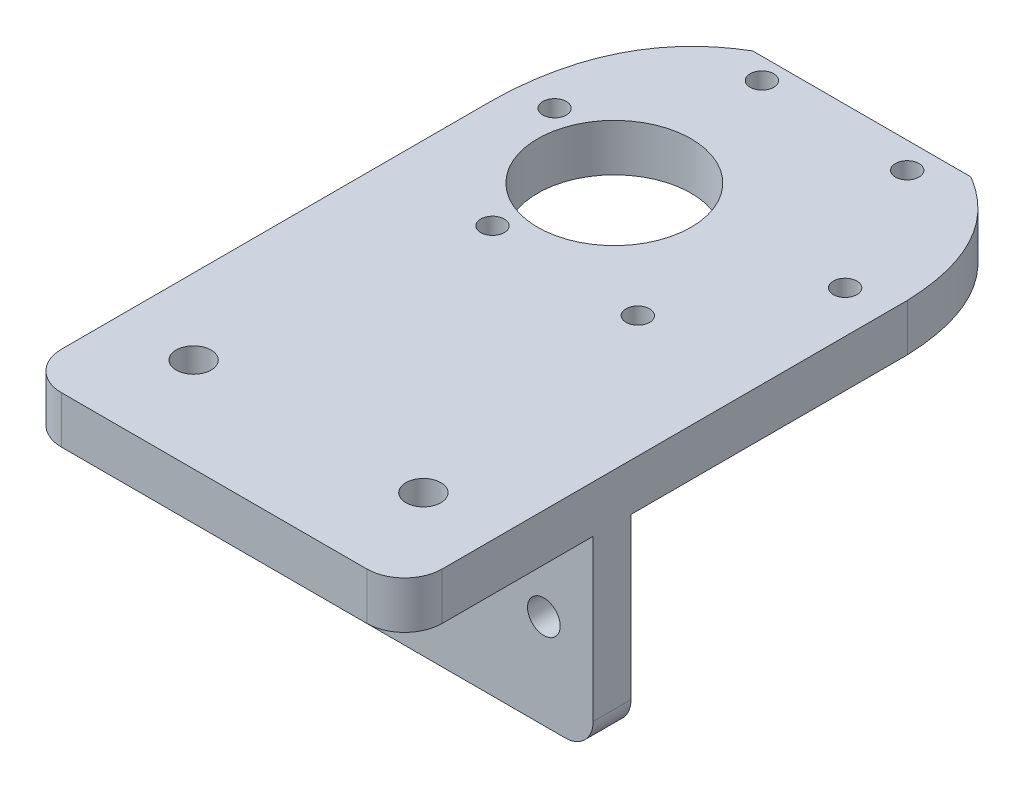
ISO-10303-21;
HEADER;
FILE_DESCRIPTION(('STEP AP214'),'2;1');
FILE_NAME('part.step','',(''),(''),'','','');
FILE_SCHEMA(('AUTOMOTIVE_DESIGN { 1 0 10303 214 1 1 1 1 }'));
ENDSEC;
DATA;
#1=APPLICATION_CONTEXT('core data for automotive mechanical design processes');
#2=APPLICATION_PROTOCOL_DEFINITION('international standard','automotive_design',2000,#1);
#3=PRODUCT_CONTEXT('',#1,'mechanical');
#4=PRODUCT('Part','Part','',(#3));
#5=PRODUCT_RELATED_PRODUCT_CATEGORY('part','',(#4));
#6=PRODUCT_DEFINITION_FORMATION('','',#4);
#7=PRODUCT_DEFINITION_CONTEXT('part definition',#1,'design');
#8=PRODUCT_DEFINITION('design','',#6,#7);
#9=PRODUCT_DEFINITION_SHAPE('','',#8);
#10=(LENGTH_UNIT() NAMED_UNIT(*) SI_UNIT(.MILLI.,.METRE.));
#11=(NAMED_UNIT(*) PLANE_ANGLE_UNIT() SI_UNIT($,.RADIAN.));
#12=(NAMED_UNIT(*) SI_UNIT($,.STERADIAN.) SOLID_ANGLE_UNIT());
#13=UNCERTAINTY_MEASURE_WITH_UNIT(LENGTH_MEASURE(1.E-05),#10,'distance_accuracy_value','');
#14=(GEOMETRIC_REPRESENTATION_CONTEXT(3) GLOBAL_UNCERTAINTY_ASSIGNED_CONTEXT((#13)) GLOBAL_UNIT_ASSIGNED_CONTEXT((#10,
#11,#12)) REPRESENTATION_CONTEXT('',''));
#15=CARTESIAN_POINT('',(0.,0.,0.));
#16=DIRECTION('',(0.,0.,1.));
#17=DIRECTION('',(1.,0.,0.));
#18=AXIS2_PLACEMENT_3D('',#15,#16,#17);
#19=CARTESIAN_POINT('',(42.1412127925836,-12.433023222912,0.));
#20=DIRECTION('',(0.,0.,1.));
#21=DIRECTION('',(1.,0.,0.));
#22=AXIS2_PLACEMENT_3D('',#19,#20,#21);
#23=PLANE('',#22);
#24=CARTESIAN_POINT('',(41.9112127925836,-59.4330232229214,0.));
#25=DIRECTION('',(0.,0.,1.));
#26=DIRECTION('',(1.,0.,0.));
#27=AXIS2_PLACEMENT_3D('',#24,#25,#26);
#28=CIRCLE('',#27,1.73);
#29=CARTESIAN_POINT('',(43.6412127925836,-59.4330232229214,0.));
#30=VERTEX_POINT('',#29);
#31=EDGE_CURVE('E195',#30,#30,#28,.T.);
#32=ORIENTED_EDGE('',*,*,#31,.T.);
#33=EDGE_LOOP('',(#32));
#34=FACE_BOUND('',#33,.T.);
#35=CARTESIAN_POINT('',(12.0212127925836,-59.4330232229214,0.));
#36=DIRECTION('',(0.,0.,1.));
#37=DIRECTION('',(1.,0.,0.));
#38=AXIS2_PLACEMENT_3D('',#35,#36,#37);
#39=CIRCLE('',#38,1.73);
#40=CARTESIAN_POINT('',(13.7512127925836,-59.4330232229214,0.));
#41=VERTEX_POINT('',#40);
#42=EDGE_CURVE('E199',#41,#41,#39,.T.);
#43=ORIENTED_EDGE('',*,*,#42,.T.);
#44=EDGE_LOOP('',(#43));
#45=FACE_BOUND('',#44,.T.);
#46=DIRECTION('',(-1.,0.,0.));
#47=VECTOR('',#46,1.);
#48=CARTESIAN_POINT('',(6.79121279258359,-49.4330232229125,0.));
#49=LINE('',#48,#47);
#50=CARTESIAN_POINT('',(47.1412127925836,-49.4330232229125,0.));
#51=VERTEX_POINT('',#50);
#52=CARTESIAN_POINT('',(6.79121279258359,-49.4330232229125,0.));
#53=VERTEX_POINT('',#52);
#54=EDGE_CURVE('E163',#51,#53,#49,.T.);
#55=ORIENTED_EDGE('',*,*,#54,.F.);
#56=DIRECTION('',(0.,1.,0.));
#57=VECTOR('',#56,1.);
#58=CARTESIAN_POINT('',(47.1412127925836,-66.4330232229125,0.));
#59=LINE('',#58,#57);
#60=CARTESIAN_POINT('',(47.1412127925836,-66.4330232229125,0.));
#61=VERTEX_POINT('',#60);
#62=EDGE_CURVE('E211',#61,#51,#59,.T.);
#63=ORIENTED_EDGE('',*,*,#62,.F.);
#64=CARTESIAN_POINT('',(44.1412127925836,-66.4330232229125,0.));
#65=DIRECTION('',(0.,0.,1.));
#66=DIRECTION('',(-1.,0.,0.));
#67=AXIS2_PLACEMENT_3D('',#64,#65,#66);
#68=CIRCLE('',#67,3.);
#69=CARTESIAN_POINT('',(44.1412127925836,-69.4330232229125,0.));
#70=VERTEX_POINT('',#69);
#71=EDGE_CURVE('E226',#70,#61,#68,.T.);
#72=ORIENTED_EDGE('',*,*,#71,.F.);
#73=DIRECTION('',(1.,0.,0.));
#74=VECTOR('',#73,1.);
#75=CARTESIAN_POINT('',(44.1412127925836,-69.4330232229125,0.));
#76=LINE('',#75,#74);
#77=CARTESIAN_POINT('',(9.79121279258358,-69.4330232229125,0.));
#78=VERTEX_POINT('',#77);
#79=EDGE_CURVE('E224',#78,#70,#76,.T.);
#80=ORIENTED_EDGE('',*,*,#79,.F.);
#81=CARTESIAN_POINT('',(9.79121279258358,-66.4330232229125,0.));
#82=DIRECTION('',(0.,0.,1.));
#83=DIRECTION('',(1.,0.,0.));
#84=AXIS2_PLACEMENT_3D('',#81,#82,#83);
#85=CIRCLE('',#84,3.);
#86=CARTESIAN_POINT('',(6.79121279258358,-66.4330232229125,0.));
#87=VERTEX_POINT('',#86);
#88=EDGE_CURVE('E222',#87,#78,#85,.T.);
#89=ORIENTED_EDGE('',*,*,#88,.F.);
#90=DIRECTION('',(0.,-1.,0.));
#91=VECTOR('',#90,1.);
#92=CARTESIAN_POINT('',(6.7912127925836,-12.433023222912,0.));
#93=LINE('',#92,#91);
#94=EDGE_CURVE('E205',#53,#87,#93,.T.);
#95=ORIENTED_EDGE('',*,*,#94,.F.);
#96=EDGE_LOOP('',(#55,#63,#72,#80,#89,#95));
#97=FACE_BOUND('',#96,.T.);
#98=ADVANCED_FACE('F43',(#34,#45,#97),#23,.F.);
#99=CARTESIAN_POINT('',(42.1412127925836,-12.433023222912,4.));
#100=DIRECTION('',(0.,0.,1.));
#101=DIRECTION('',(1.,0.,0.));
#102=AXIS2_PLACEMENT_3D('',#99,#100,#101);
#103=PLANE('',#102);
#104=DIRECTION('',(1.,0.,0.));
#105=VECTOR('',#104,1.);
#106=CARTESIAN_POINT('',(47.1412127925836,-49.4330232229125,4.));
#107=LINE('',#106,#105);
#108=CARTESIAN_POINT('',(6.79121279258359,-49.4330232229125,4.));
#109=VERTEX_POINT('',#108);
#110=CARTESIAN_POINT('',(47.1412127925836,-49.4330232229125,4.));
#111=VERTEX_POINT('',#110);
#112=EDGE_CURVE('E181',#109,#111,#107,.T.);
#113=ORIENTED_EDGE('',*,*,#112,.F.);
#114=DIRECTION('',(0.,-1.,0.));
#115=VECTOR('',#114,1.);
#116=CARTESIAN_POINT('',(6.7912127925836,-12.433023222912,4.));
#117=LINE('',#116,#115);
#118=CARTESIAN_POINT('',(6.79121279258358,-66.4330232229125,4.));
#119=VERTEX_POINT('',#118);
#120=EDGE_CURVE('E208',#109,#119,#117,.T.);
#121=ORIENTED_EDGE('',*,*,#120,.T.);
#122=CARTESIAN_POINT('',(9.79121279258358,-66.4330232229125,4.));
#123=DIRECTION('',(0.,0.,1.));
#124=DIRECTION('',(1.,0.,0.));
#125=AXIS2_PLACEMENT_3D('',#122,#123,#124);
#126=CIRCLE('',#125,3.);
#127=CARTESIAN_POINT('',(9.79121279258358,-69.4330232229125,4.));
#128=VERTEX_POINT('',#127);
#129=EDGE_CURVE('E210',#119,#128,#126,.T.);
#130=ORIENTED_EDGE('',*,*,#129,.T.);
#131=DIRECTION('',(1.,0.,0.));
#132=VECTOR('',#131,1.);
#133=CARTESIAN_POINT('',(44.1412127925836,-69.4330232229125,4.));
#134=LINE('',#133,#132);
#135=CARTESIAN_POINT('',(44.1412127925836,-69.4330232229125,4.));
#136=VERTEX_POINT('',#135);
#137=EDGE_CURVE('E213',#128,#136,#134,.T.);
#138=ORIENTED_EDGE('',*,*,#137,.T.);
#139=CARTESIAN_POINT('',(44.1412127925836,-66.4330232229125,4.));
#140=DIRECTION('',(0.,0.,1.));
#141=DIRECTION('',(-1.,0.,0.));
#142=AXIS2_PLACEMENT_3D('',#139,#140,#141);
#143=CIRCLE('',#142,3.);
#144=CARTESIAN_POINT('',(47.1412127925836,-66.4330232229125,4.));
#145=VERTEX_POINT('',#144);
#146=EDGE_CURVE('E215',#136,#145,#143,.T.);
#147=ORIENTED_EDGE('',*,*,#146,.T.);
#148=DIRECTION('',(0.,1.,0.));
#149=VECTOR('',#148,1.);
#150=CARTESIAN_POINT('',(47.1412127925836,-66.4330232229125,4.));
#151=LINE('',#150,#149);
#152=EDGE_CURVE('E217',#145,#111,#151,.T.);
#153=ORIENTED_EDGE('',*,*,#152,.T.);
#154=EDGE_LOOP('',(#113,#121,#130,#138,#147,#153));
#155=FACE_BOUND('',#154,.T.);
#156=CARTESIAN_POINT('',(12.0212127925836,-59.4330232229214,4.));
#157=DIRECTION('',(0.,0.,1.));
#158=DIRECTION('',(1.,0.,0.));
#159=AXIS2_PLACEMENT_3D('',#156,#157,#158);
#160=CIRCLE('',#159,1.73);
#161=CARTESIAN_POINT('',(13.7512127925836,-59.4330232229214,4.));
#162=VERTEX_POINT('',#161);
#163=EDGE_CURVE('E202',#162,#162,#160,.T.);
#164=ORIENTED_EDGE('',*,*,#163,.F.);
#165=EDGE_LOOP('',(#164));
#166=FACE_BOUND('',#165,.T.);
#167=CARTESIAN_POINT('',(41.9112127925836,-59.4330232229214,4.));
#168=DIRECTION('',(0.,0.,1.));
#169=DIRECTION('',(1.,0.,0.));
#170=AXIS2_PLACEMENT_3D('',#167,#168,#169);
#171=CIRCLE('',#170,1.73);
#172=CARTESIAN_POINT('',(43.6412127925836,-59.4330232229214,4.));
#173=VERTEX_POINT('',#172);
#174=EDGE_CURVE('E196',#173,#173,#171,.T.);
#175=ORIENTED_EDGE('',*,*,#174,.F.);
#176=EDGE_LOOP('',(#175));
#177=FACE_BOUND('',#176,.T.);
#178=ADVANCED_FACE('F282',(#155,#166,#177),#103,.T.);
#179=CARTESIAN_POINT('',(6.7912127925836,-12.433023222912,4.));
#180=DIRECTION('',(1.,0.,0.));
#181=DIRECTION('',(0.,1.,0.));
#182=AXIS2_PLACEMENT_3D('',#179,#180,#181);
#183=PLANE('',#182);
#184=DIRECTION('',(0.,0.,-1.));
#185=VECTOR('',#184,1.);
#186=CARTESIAN_POINT('',(6.79121279258359,-44.4330232229125,24.));
#187=LINE('',#186,#185);
#188=CARTESIAN_POINT('',(6.79121279258359,-44.4330232229125,20.));
#189=VERTEX_POINT('',#188);
#190=CARTESIAN_POINT('',(6.79121279248702,-44.4330232229125,-25.4525738160012));
#191=VERTEX_POINT('',#190);
#192=EDGE_CURVE('E193',#189,#191,#187,.T.);
#193=ORIENTED_EDGE('',*,*,#192,.T.);
#194=DIRECTION('',(0.,-1.,0.));
#195=VECTOR('',#194,1.);
#196=CARTESIAN_POINT('',(6.79121279257632,-39.4330232229125,-25.452573825034));
#197=LINE('',#196,#195);
#198=CARTESIAN_POINT('',(6.79121279248697,-49.4330232229125,-25.4525738159967));
#199=VERTEX_POINT('',#198);
#200=EDGE_CURVE('E370',#191,#199,#197,.T.);
#201=ORIENTED_EDGE('',*,*,#200,.T.);
#202=DIRECTION('',(0.,0.,1.));
#203=VECTOR('',#202,1.);
#204=CARTESIAN_POINT('',(6.79121279258359,-49.4330232229125,-44.));
#205=LINE('',#204,#203);
#206=EDGE_CURVE('E155',#199,#53,#205,.T.);
#207=ORIENTED_EDGE('',*,*,#206,.T.);
#208=ORIENTED_EDGE('',*,*,#94,.T.);
#209=DIRECTION('',(0.,0.,-1.));
#210=VECTOR('',#209,1.);
#211=CARTESIAN_POINT('',(6.79121279258358,-66.4330232229125,4.));
#212=LINE('',#211,#210);
#213=EDGE_CURVE('E238',#119,#87,#212,.T.);
#214=ORIENTED_EDGE('',*,*,#213,.F.);
#215=ORIENTED_EDGE('',*,*,#120,.F.);
#216=DIRECTION('',(0.,0.,-1.));
#217=VECTOR('',#216,1.);
#218=CARTESIAN_POINT('',(6.79121279258359,-49.4330232229125,24.));
#219=LINE('',#218,#217);
#220=CARTESIAN_POINT('',(6.79121279258359,-49.4330232229125,20.));
#221=VERTEX_POINT('',#220);
#222=EDGE_CURVE('E191',#221,#109,#219,.T.);
#223=ORIENTED_EDGE('',*,*,#222,.F.);
#224=DIRECTION('',(0.,-1.,0.));
#225=VECTOR('',#224,1.);
#226=CARTESIAN_POINT('',(6.79121279258359,-44.4330232229125,20.));
#227=LINE('',#226,#225);
#228=EDGE_CURVE('E257',#221,#189,#227,.F.);
#229=ORIENTED_EDGE('',*,*,#228,.T.);
#230=EDGE_LOOP('',(#193,#201,#207,#208,#214,#215,#223,#229));
#231=FACE_BOUND('',#230,.T.);
#232=ADVANCED_FACE('F288',(#231),#183,.F.);
#233=CARTESIAN_POINT('',(9.79121279258358,-66.4330232229125,4.));
#234=DIRECTION('',(0.,0.,-1.));
#235=DIRECTION('',(-1.,0.,0.));
#236=AXIS2_PLACEMENT_3D('',#233,#234,#235);
#237=CYLINDRICAL_SURFACE('',#236,3.);
#238=ORIENTED_EDGE('',*,*,#88,.T.);
#239=DIRECTION('',(0.,0.,-1.));
#240=VECTOR('',#239,1.);
#241=CARTESIAN_POINT('',(9.79121279258358,-69.4330232229125,4.));
#242=LINE('',#241,#240);
#243=EDGE_CURVE('E235',#128,#78,#242,.T.);
#244=ORIENTED_EDGE('',*,*,#243,.F.);
#245=ORIENTED_EDGE('',*,*,#129,.F.);
#246=ORIENTED_EDGE('',*,*,#213,.T.);
#247=EDGE_LOOP('',(#238,#244,#245,#246));
#248=FACE_BOUND('',#247,.T.);
#249=ADVANCED_FACE('F306',(#248),#237,.T.);
#250=CARTESIAN_POINT('',(44.1412127925836,-69.4330232229125,4.));
#251=DIRECTION('',(0.,1.,0.));
#252=DIRECTION('',(0.,0.,1.));
#253=AXIS2_PLACEMENT_3D('',#250,#251,#252);
#254=PLANE('',#253);
#255=ORIENTED_EDGE('',*,*,#79,.T.);
#256=DIRECTION('',(0.,0.,-1.));
#257=VECTOR('',#256,1.);
#258=CARTESIAN_POINT('',(44.1412127925836,-69.4330232229125,4.));
#259=LINE('',#258,#257);
#260=EDGE_CURVE('E232',#136,#70,#259,.T.);
#261=ORIENTED_EDGE('',*,*,#260,.F.);
#262=ORIENTED_EDGE('',*,*,#137,.F.);
#263=ORIENTED_EDGE('',*,*,#243,.T.);
#264=EDGE_LOOP('',(#255,#261,#262,#263));
#265=FACE_BOUND('',#264,.T.);
#266=ADVANCED_FACE('F302',(#265),#254,.F.);
#267=CARTESIAN_POINT('',(44.1412127925836,-66.4330232229125,4.));
#268=DIRECTION('',(0.,0.,-1.));
#269=DIRECTION('',(-1.,0.,0.));
#270=AXIS2_PLACEMENT_3D('',#267,#268,#269);
#271=CYLINDRICAL_SURFACE('',#270,3.);
#272=ORIENTED_EDGE('',*,*,#71,.T.);
#273=DIRECTION('',(0.,0.,-1.));
#274=VECTOR('',#273,1.);
#275=CARTESIAN_POINT('',(47.1412127925836,-66.4330232229125,4.));
#276=LINE('',#275,#274);
#277=EDGE_CURVE('E220',#145,#61,#276,.T.);
#278=ORIENTED_EDGE('',*,*,#277,.F.);
#279=ORIENTED_EDGE('',*,*,#146,.F.);
#280=ORIENTED_EDGE('',*,*,#260,.T.);
#281=EDGE_LOOP('',(#272,#278,#279,#280));
#282=FACE_BOUND('',#281,.T.);
#283=ADVANCED_FACE('F298',(#282),#271,.T.);
#284=CARTESIAN_POINT('',(47.1412127925836,-66.4330232229125,4.));
#285=DIRECTION('',(-1.,0.,0.));
#286=DIRECTION('',(0.,-1.,0.));
#287=AXIS2_PLACEMENT_3D('',#284,#285,#286);
#288=PLANE('',#287);
#289=ORIENTED_EDGE('',*,*,#62,.T.);
#290=DIRECTION('',(0.,0.,1.));
#291=VECTOR('',#290,1.);
#292=CARTESIAN_POINT('',(47.1412127925836,-49.4330232229125,-44.));
#293=LINE('',#292,#291);
#294=CARTESIAN_POINT('',(47.1412127925836,-49.4330232229125,-29.3051124368319));
#295=VERTEX_POINT('',#294);
#296=EDGE_CURVE('E161',#295,#51,#293,.T.);
#297=ORIENTED_EDGE('',*,*,#296,.F.);
#298=DIRECTION('',(0.,-1.,0.));
#299=VECTOR('',#298,1.);
#300=CARTESIAN_POINT('',(47.1412127925836,-39.4330232229125,-29.305112436832));
#301=LINE('',#300,#299);
#302=CARTESIAN_POINT('',(47.1412127925836,-44.4330232229125,-29.3051124368319));
#303=VERTEX_POINT('',#302);
#304=EDGE_CURVE('E349',#295,#303,#301,.F.);
#305=ORIENTED_EDGE('',*,*,#304,.T.);
#306=DIRECTION('',(0.,0.,-1.));
#307=VECTOR('',#306,1.);
#308=CARTESIAN_POINT('',(47.1412127925836,-44.4330232229125,24.));
#309=LINE('',#308,#307);
#310=CARTESIAN_POINT('',(47.1412127925836,-44.4330232229125,20.));
#311=VERTEX_POINT('',#310);
#312=EDGE_CURVE('E184',#311,#303,#309,.T.);
#313=ORIENTED_EDGE('',*,*,#312,.F.);
#314=DIRECTION('',(0.,1.,0.));
#315=VECTOR('',#314,1.);
#316=CARTESIAN_POINT('',(47.1412127925836,-49.4330232229125,20.));
#317=LINE('',#316,#315);
#318=CARTESIAN_POINT('',(47.1412127925836,-49.4330232229125,20.));
#319=VERTEX_POINT('',#318);
#320=EDGE_CURVE('E251',#311,#319,#317,.F.);
#321=ORIENTED_EDGE('',*,*,#320,.T.);
#322=DIRECTION('',(0.,0.,-1.));
#323=VECTOR('',#322,1.);
#324=CARTESIAN_POINT('',(47.1412127925836,-49.4330232229125,24.));
#325=LINE('',#324,#323);
#326=EDGE_CURVE('E189',#319,#111,#325,.T.);
#327=ORIENTED_EDGE('',*,*,#326,.T.);
#328=ORIENTED_EDGE('',*,*,#152,.F.);
#329=ORIENTED_EDGE('',*,*,#277,.T.);
#330=EDGE_LOOP('',(#289,#297,#305,#313,#321,#327,#328,#329));
#331=FACE_BOUND('',#330,.T.);
#332=ADVANCED_FACE('F294',(#331),#288,.F.);
#333=CARTESIAN_POINT('',(12.0212127925836,-59.4330232229214,4.));
#334=DIRECTION('',(0.,0.,-1.));
#335=DIRECTION('',(-1.,0.,0.));
#336=AXIS2_PLACEMENT_3D('',#333,#334,#335);
#337=CYLINDRICAL_SURFACE('',#336,1.73);
#338=ORIENTED_EDGE('',*,*,#163,.T.);
#339=EDGE_LOOP('',(#338));
#340=FACE_BOUND('',#339,.T.);
#341=ORIENTED_EDGE('',*,*,#42,.F.);
#342=EDGE_LOOP('',(#341));
#343=FACE_BOUND('',#342,.T.);
#344=ADVANCED_FACE('F297',(#340,#343),#337,.F.);
#345=CARTESIAN_POINT('',(41.9112127925836,-59.4330232229214,4.));
#346=DIRECTION('',(0.,0.,-1.));
#347=DIRECTION('',(-1.,0.,0.));
#348=AXIS2_PLACEMENT_3D('',#345,#346,#347);
#349=CYLINDRICAL_SURFACE('',#348,1.73);
#350=ORIENTED_EDGE('',*,*,#174,.T.);
#351=EDGE_LOOP('',(#350));
#352=FACE_BOUND('',#351,.T.);
#353=ORIENTED_EDGE('',*,*,#31,.F.);
#354=EDGE_LOOP('',(#353));
#355=FACE_BOUND('',#354,.T.);
#356=ADVANCED_FACE('F478',(#352,#355),#349,.F.);
#357=CARTESIAN_POINT('',(47.1412127925836,-44.4330232229125,24.));
#358=DIRECTION('',(0.,-1.,0.));
#359=DIRECTION('',(1.,0.,0.));
#360=AXIS2_PLACEMENT_3D('',#357,#358,#359);
#361=PLANE('',#360);
#362=CARTESIAN_POINT('',(18.3090913463404,-44.4330232229125,-14.1622623098105));
#363=DIRECTION('',(0.,-1.,0.));
#364=DIRECTION('',(1.,0.,0.));
#365=AXIS2_PLACEMENT_3D('',#362,#363,#364);
#366=CIRCLE('',#365,1.25);
#367=CARTESIAN_POINT('',(19.5590913463404,-44.4330232229125,-14.1622623098105));
#368=VERTEX_POINT('',#367);
#369=EDGE_CURVE('E167',#368,#368,#366,.T.);
#370=ORIENTED_EDGE('',*,*,#369,.T.);
#371=EDGE_LOOP('',(#370));
#372=FACE_BOUND('',#371,.T.);
#373=CARTESIAN_POINT('',(10.8089551551607,-44.4330232229125,-28.2388548347699));
#374=DIRECTION('',(0.,-1.,0.));
#375=DIRECTION('',(1.,0.,0.));
#376=AXIS2_PLACEMENT_3D('',#373,#374,#375);
#377=CIRCLE('',#376,1.25);
#378=CARTESIAN_POINT('',(12.0589551551607,-44.4330232229125,-28.2388548347699));
#379=VERTEX_POINT('',#378);
#380=EDGE_CURVE('E390',#379,#379,#377,.T.);
#381=ORIENTED_EDGE('',*,*,#380,.T.);
#382=EDGE_LOOP('',(#381));
#383=FACE_BOUND('',#382,.T.);
#384=CARTESIAN_POINT('',(19.2495737849078,-44.4330232229125,-41.7724595706543));
#385=DIRECTION('',(0.,-1.,0.));
#386=DIRECTION('',(1.,0.,0.));
#387=AXIS2_PLACEMENT_3D('',#384,#385,#386);
#388=CIRCLE('',#387,1.25);
#389=CARTESIAN_POINT('',(20.4995737849078,-44.4330232229125,-41.7724595706543));
#390=VERTEX_POINT('',#389);
#391=EDGE_CURVE('E387',#390,#390,#388,.T.);
#392=ORIENTED_EDGE('',*,*,#391,.T.);
#393=EDGE_LOOP('',(#392));
#394=FACE_BOUND('',#393,.T.);
#395=CARTESIAN_POINT('',(35.1903286058347,-44.4330232229125,-41.2294717815793));
#396=DIRECTION('',(0.,-1.,0.));
#397=DIRECTION('',(1.,0.,0.));
#398=AXIS2_PLACEMENT_3D('',#395,#396,#397);
#399=CIRCLE('',#398,1.24999999999999);
#400=CARTESIAN_POINT('',(36.4403286058347,-44.4330232229125,-41.2294717815793));
#401=VERTEX_POINT('',#400);
#402=EDGE_CURVE('E384',#401,#401,#399,.T.);
#403=ORIENTED_EDGE('',*,*,#402,.T.);
#404=EDGE_LOOP('',(#403));
#405=FACE_BOUND('',#404,.T.);
#406=CARTESIAN_POINT('',(42.6904647970144,-44.4330232229125,-27.1528792566199));
#407=DIRECTION('',(0.,-1.,0.));
#408=DIRECTION('',(1.,0.,0.));
#409=AXIS2_PLACEMENT_3D('',#406,#407,#408);
#410=CIRCLE('',#409,1.25);
#411=CARTESIAN_POINT('',(43.9404647970144,-44.4330232229125,-27.1528792566199));
#412=VERTEX_POINT('',#411);
#413=EDGE_CURVE('E381',#412,#412,#410,.T.);
#414=ORIENTED_EDGE('',*,*,#413,.T.);
#415=EDGE_LOOP('',(#414));
#416=FACE_BOUND('',#415,.T.);
#417=CARTESIAN_POINT('',(34.2498461672673,-44.4330232229125,-13.6192745207354));
#418=DIRECTION('',(0.,-1.,0.));
#419=DIRECTION('',(1.,0.,0.));
#420=AXIS2_PLACEMENT_3D('',#417,#418,#419);
#421=CIRCLE('',#420,1.25);
#422=CARTESIAN_POINT('',(35.4998461672673,-44.4330232229125,-13.6192745207354));
#423=VERTEX_POINT('',#422);
#424=EDGE_CURVE('E378',#423,#423,#421,.T.);
#425=ORIENTED_EDGE('',*,*,#424,.T.);
#426=EDGE_LOOP('',(#425));
#427=FACE_BOUND('',#426,.T.);
#428=CARTESIAN_POINT('',(20.8366585706178,-44.4330232229125,-24.5453396174247));
#429=DIRECTION('',(0.,-1.,0.));
#430=DIRECTION('',(1.,0.,0.));
#431=AXIS2_PLACEMENT_3D('',#428,#429,#430);
#432=CIRCLE('',#431,8.132834803738);
#433=CARTESIAN_POINT('',(28.9694933743559,-44.4330232229125,-24.5453396174247));
#434=VERTEX_POINT('',#433);
#435=EDGE_CURVE('E375',#434,#434,#432,.T.);
#436=ORIENTED_EDGE('',*,*,#435,.T.);
#437=EDGE_LOOP('',(#436));
#438=FACE_BOUND('',#437,.T.);
#439=CARTESIAN_POINT('',(39.1412127925836,-44.4330232229125,13.999999999996));
#440=DIRECTION('',(0.,1.,0.));
#441=DIRECTION('',(-1.,0.,0.));
#442=AXIS2_PLACEMENT_3D('',#439,#440,#441);
#443=CIRCLE('',#442,1.85);
#444=CARTESIAN_POINT('',(37.2912127925836,-44.4330232229125,13.999999999996));
#445=VERTEX_POINT('',#444);
#446=EDGE_CURVE('E171',#445,#445,#443,.T.);
#447=ORIENTED_EDGE('',*,*,#446,.F.);
#448=EDGE_LOOP('',(#447));
#449=FACE_BOUND('',#448,.T.);
#450=CARTESIAN_POINT('',(14.7912127925836,-44.4330232229125,13.999999999996));
#451=DIRECTION('',(0.,1.,0.));
#452=DIRECTION('',(-1.,0.,0.));
#453=AXIS2_PLACEMENT_3D('',#450,#451,#452);
#454=CIRCLE('',#453,1.85);
#455=CARTESIAN_POINT('',(12.9412127925836,-44.4330232229125,13.999999999996));
#456=VERTEX_POINT('',#455);
#457=EDGE_CURVE('E170',#456,#456,#454,.T.);
#458=ORIENTED_EDGE('',*,*,#457,.F.);
#459=EDGE_LOOP('',(#458));
#460=FACE_BOUND('',#459,.T.);
#461=DIRECTION('',(1.,0.,0.));
#462=VECTOR('',#461,1.);
#463=CARTESIAN_POINT('',(6.79121279258359,-44.4330232229125,-44.));
#464=LINE('',#463,#462);
#465=CARTESIAN_POINT('',(16.0418523019459,-44.4330232229125,-44.));
#466=VERTEX_POINT('',#465);
#467=CARTESIAN_POINT('',(39.159702779081,-44.4330232229125,-44.));
#468=VERTEX_POINT('',#467);
#469=EDGE_CURVE('E159',#466,#468,#464,.T.);
#470=ORIENTED_EDGE('',*,*,#469,.F.);
#471=CARTESIAN_POINT('',(26.7497099760867,-44.4330232229125,-47.3242888794548));
#472=CARTESIAN_POINT('',(6.59502188582584,-44.4330232229125,-44.8678957311125));
#473=CARTESIAN_POINT('',(6.79121279258359,-44.4330232229125,-24.6807140661919));
#474=B_SPLINE_CURVE_WITH_KNOTS('',2,(#471,#472,#473),.UNSPECIFIED.,.F.,.F.,(3,3),(0.,1.),.UNSPECIFIED.);
#475=EDGE_CURVE('E66',#466,#191,#474,.T.);
#476=ORIENTED_EDGE('',*,*,#475,.T.);
#477=ORIENTED_EDGE('',*,*,#192,.F.);
#478=CARTESIAN_POINT('',(10.7912127925836,-44.4330232229125,20.));
#479=DIRECTION('',(0.,-1.,0.));
#480=DIRECTION('',(1.,0.,0.));
#481=AXIS2_PLACEMENT_3D('',#478,#479,#480);
#482=CIRCLE('',#481,4.);
#483=CARTESIAN_POINT('',(10.7912127925836,-44.4330232229125,24.));
#484=VERTEX_POINT('',#483);
#485=EDGE_CURVE('E247',#189,#484,#482,.F.);
#486=ORIENTED_EDGE('',*,*,#485,.T.);
#487=DIRECTION('',(-1.,0.,0.));
#488=VECTOR('',#487,1.);
#489=CARTESIAN_POINT('',(47.1412127925836,-44.4330232229125,24.));
#490=LINE('',#489,#488);
#491=CARTESIAN_POINT('',(43.1412127925836,-44.4330232229125,24.));
#492=VERTEX_POINT('',#491);
#493=EDGE_CURVE('E177',#492,#484,#490,.T.);
#494=ORIENTED_EDGE('',*,*,#493,.F.);
#495=CARTESIAN_POINT('',(43.1412127925836,-44.4330232229125,20.));
#496=DIRECTION('',(0.,-1.,0.));
#497=DIRECTION('',(1.,0.,0.));
#498=AXIS2_PLACEMENT_3D('',#495,#496,#497);
#499=CIRCLE('',#498,4.);
#500=EDGE_CURVE('E249',#492,#311,#499,.F.);
#501=ORIENTED_EDGE('',*,*,#500,.T.);
#502=ORIENTED_EDGE('',*,*,#312,.T.);
#503=CARTESIAN_POINT('',(47.1412127925834,-44.4330232229125,-27.1902601866067));
#504=CARTESIAN_POINT('',(47.7707375564252,-44.4330232229125,-45.8748462644802));
#505=CARTESIAN_POINT('',(26.7497099760867,-44.4330232229125,-47.3242888794548));
#506=B_SPLINE_CURVE_WITH_KNOTS('',2,(#503,#504,#505),.UNSPECIFIED.,.F.,.F.,(3,3),(0.,1.),.UNSPECIFIED.);
#507=EDGE_CURVE('E354',#303,#468,#506,.T.);
#508=ORIENTED_EDGE('',*,*,#507,.T.);
#509=EDGE_LOOP('',(#470,#476,#477,#486,#494,#501,#502,#508));
#510=FACE_BOUND('',#509,.T.);
#511=ADVANCED_FACE('F353',(#372,#383,#394,#405,#416,#427,#438,#449,#460,#510),#361,.F.);
#512=CARTESIAN_POINT('',(47.1412127925836,-49.4330232229125,24.));
#513=DIRECTION('',(0.,1.,0.));
#514=DIRECTION('',(-1.,0.,0.));
#515=AXIS2_PLACEMENT_3D('',#512,#513,#514);
#516=PLANE('',#515);
#517=CARTESIAN_POINT('',(39.1412127925836,-49.4330232229125,13.999999999996));
#518=DIRECTION('',(0.,1.,0.));
#519=DIRECTION('',(-1.,0.,0.));
#520=AXIS2_PLACEMENT_3D('',#517,#518,#519);
#521=CIRCLE('',#520,1.85);
#522=CARTESIAN_POINT('',(37.2912127925836,-49.4330232229125,13.999999999996));
#523=VERTEX_POINT('',#522);
#524=EDGE_CURVE('E187',#523,#523,#521,.T.);
#525=ORIENTED_EDGE('',*,*,#524,.T.);
#526=EDGE_LOOP('',(#525));
#527=FACE_BOUND('',#526,.T.);
#528=CARTESIAN_POINT('',(14.7912127925836,-49.4330232229125,13.999999999996));
#529=DIRECTION('',(0.,1.,0.));
#530=DIRECTION('',(-1.,0.,0.));
#531=AXIS2_PLACEMENT_3D('',#528,#529,#530);
#532=CIRCLE('',#531,1.85);
#533=CARTESIAN_POINT('',(12.9412127925836,-49.4330232229125,13.999999999996));
#534=VERTEX_POINT('',#533);
#535=EDGE_CURVE('E174',#534,#534,#532,.T.);
#536=ORIENTED_EDGE('',*,*,#535,.T.);
#537=EDGE_LOOP('',(#536));
#538=FACE_BOUND('',#537,.T.);
#539=ORIENTED_EDGE('',*,*,#326,.F.);
#540=CARTESIAN_POINT('',(43.1412127925836,-49.4330232229125,20.));
#541=DIRECTION('',(0.,1.,0.));
#542=DIRECTION('',(-1.,0.,0.));
#543=AXIS2_PLACEMENT_3D('',#540,#541,#542);
#544=CIRCLE('',#543,4.);
#545=CARTESIAN_POINT('',(43.1412127925836,-49.4330232229125,24.));
#546=VERTEX_POINT('',#545);
#547=EDGE_CURVE('E255',#319,#546,#544,.F.);
#548=ORIENTED_EDGE('',*,*,#547,.T.);
#549=DIRECTION('',(1.,0.,0.));
#550=VECTOR('',#549,1.);
#551=CARTESIAN_POINT('',(47.1412127925836,-49.4330232229125,24.));
#552=LINE('',#551,#550);
#553=CARTESIAN_POINT('',(10.7912127925836,-49.4330232229125,24.));
#554=VERTEX_POINT('',#553);
#555=EDGE_CURVE('E180',#554,#546,#552,.T.);
#556=ORIENTED_EDGE('',*,*,#555,.F.);
#557=CARTESIAN_POINT('',(10.7912127925836,-49.4330232229125,20.));
#558=DIRECTION('',(0.,1.,0.));
#559=DIRECTION('',(-1.,0.,0.));
#560=AXIS2_PLACEMENT_3D('',#557,#558,#559);
#561=CIRCLE('',#560,4.);
#562=EDGE_CURVE('E253',#554,#221,#561,.F.);
#563=ORIENTED_EDGE('',*,*,#562,.T.);
#564=ORIENTED_EDGE('',*,*,#222,.T.);
#565=ORIENTED_EDGE('',*,*,#112,.T.);
#566=EDGE_LOOP('',(#539,#548,#556,#563,#564,#565));
#567=FACE_BOUND('',#566,.T.);
#568=ADVANCED_FACE('F264',(#527,#538,#567),#516,.F.);
#569=CARTESIAN_POINT('',(0.,0.,24.));
#570=DIRECTION('',(0.,0.,1.));
#571=DIRECTION('',(1.,0.,0.));
#572=AXIS2_PLACEMENT_3D('',#569,#570,#571);
#573=PLANE('',#572);
#574=ORIENTED_EDGE('',*,*,#555,.T.);
#575=DIRECTION('',(0.,1.,0.));
#576=VECTOR('',#575,1.);
#577=CARTESIAN_POINT('',(43.1412127925836,-44.4330232229125,24.));
#578=LINE('',#577,#576);
#579=EDGE_CURVE('E244',#546,#492,#578,.T.);
#580=ORIENTED_EDGE('',*,*,#579,.T.);
#581=ORIENTED_EDGE('',*,*,#493,.T.);
#582=DIRECTION('',(0.,-1.,0.));
#583=VECTOR('',#582,1.);
#584=CARTESIAN_POINT('',(10.7912127925836,-49.4330232229125,24.));
#585=LINE('',#584,#583);
#586=EDGE_CURVE('E241',#484,#554,#585,.T.);
#587=ORIENTED_EDGE('',*,*,#586,.T.);
#588=EDGE_LOOP('',(#574,#580,#581,#587));
#589=FACE_BOUND('',#588,.T.);
#590=ADVANCED_FACE('F315',(#589),#573,.T.);
#591=CARTESIAN_POINT('',(43.1412127925836,0.,20.));
#592=DIRECTION('',(0.,-1.,0.));
#593=DIRECTION('',(1.,0.,0.));
#594=AXIS2_PLACEMENT_3D('',#591,#592,#593);
#595=CYLINDRICAL_SURFACE('',#594,4.);
#596=ORIENTED_EDGE('',*,*,#547,.F.);
#597=ORIENTED_EDGE('',*,*,#320,.F.);
#598=ORIENTED_EDGE('',*,*,#500,.F.);
#599=ORIENTED_EDGE('',*,*,#579,.F.);
#600=EDGE_LOOP('',(#596,#597,#598,#599));
#601=FACE_BOUND('',#600,.T.);
#602=ADVANCED_FACE('F313',(#601),#595,.T.);
#603=CARTESIAN_POINT('',(10.7912127925836,0.,20.));
#604=DIRECTION('',(0.,1.,0.));
#605=DIRECTION('',(-1.,0.,0.));
#606=AXIS2_PLACEMENT_3D('',#603,#604,#605);
#607=CYLINDRICAL_SURFACE('',#606,4.);
#608=ORIENTED_EDGE('',*,*,#485,.F.);
#609=ORIENTED_EDGE('',*,*,#228,.F.);
#610=ORIENTED_EDGE('',*,*,#562,.F.);
#611=ORIENTED_EDGE('',*,*,#586,.F.);
#612=EDGE_LOOP('',(#608,#609,#610,#611));
#613=FACE_BOUND('',#612,.T.);
#614=ADVANCED_FACE('F45',(#613),#607,.T.);
#615=CARTESIAN_POINT('',(14.7912127925836,-69.4330232229125,13.999999999996));
#616=DIRECTION('',(0.,1.,0.));
#617=DIRECTION('',(-1.,0.,0.));
#618=AXIS2_PLACEMENT_3D('',#615,#616,#617);
#619=CYLINDRICAL_SURFACE('',#618,1.85);
#620=ORIENTED_EDGE('',*,*,#457,.T.);
#621=EDGE_LOOP('',(#620));
#622=FACE_BOUND('',#621,.T.);
#623=ORIENTED_EDGE('',*,*,#535,.F.);
#624=EDGE_LOOP('',(#623));
#625=FACE_BOUND('',#624,.T.);
#626=ADVANCED_FACE('F269',(#622,#625),#619,.F.);
#627=CARTESIAN_POINT('',(39.1412127925836,-69.4330232229125,13.999999999996));
#628=DIRECTION('',(0.,1.,0.));
#629=DIRECTION('',(-1.,0.,0.));
#630=AXIS2_PLACEMENT_3D('',#627,#628,#629);
#631=CYLINDRICAL_SURFACE('',#630,1.85);
#632=ORIENTED_EDGE('',*,*,#446,.T.);
#633=EDGE_LOOP('',(#632));
#634=FACE_BOUND('',#633,.T.);
#635=ORIENTED_EDGE('',*,*,#524,.F.);
#636=EDGE_LOOP('',(#635));
#637=FACE_BOUND('',#636,.T.);
#638=ADVANCED_FACE('F267',(#634,#637),#631,.F.);
#639=CARTESIAN_POINT('',(6.79121279258359,-49.4330232229125,-44.));
#640=DIRECTION('',(0.,1.,0.));
#641=DIRECTION('',(-1.,0.,0.));
#642=AXIS2_PLACEMENT_3D('',#639,#640,#641);
#643=PLANE('',#642);
#644=CARTESIAN_POINT('',(18.3090913463404,-49.4330232229125,-14.1622623098105));
#645=DIRECTION('',(0.,-1.,0.));
#646=DIRECTION('',(1.,0.,0.));
#647=AXIS2_PLACEMENT_3D('',#644,#645,#646);
#648=CIRCLE('',#647,1.25);
#649=CARTESIAN_POINT('',(19.5590913463404,-49.4330232229125,-14.1622623098105));
#650=VERTEX_POINT('',#649);
#651=EDGE_CURVE('E156',#650,#650,#648,.T.);
#652=ORIENTED_EDGE('',*,*,#651,.F.);
#653=EDGE_LOOP('',(#652));
#654=FACE_BOUND('',#653,.T.);
#655=CARTESIAN_POINT('',(10.8089551551607,-49.4330232229125,-28.2388548347699));
#656=DIRECTION('',(0.,-1.,0.));
#657=DIRECTION('',(1.,0.,0.));
#658=AXIS2_PLACEMENT_3D('',#655,#656,#657);
#659=CIRCLE('',#658,1.25);
#660=CARTESIAN_POINT('',(12.0589551551607,-49.4330232229125,-28.2388548347699));
#661=VERTEX_POINT('',#660);
#662=EDGE_CURVE('E451',#661,#661,#659,.T.);
#663=ORIENTED_EDGE('',*,*,#662,.F.);
#664=EDGE_LOOP('',(#663));
#665=FACE_BOUND('',#664,.T.);
#666=CARTESIAN_POINT('',(19.2495737849078,-49.4330232229125,-41.7724595706543));
#667=DIRECTION('',(0.,-1.,0.));
#668=DIRECTION('',(1.,0.,0.));
#669=AXIS2_PLACEMENT_3D('',#666,#667,#668);
#670=CIRCLE('',#669,1.25);
#671=CARTESIAN_POINT('',(20.4995737849078,-49.4330232229125,-41.7724595706543));
#672=VERTEX_POINT('',#671);
#673=EDGE_CURVE('E447',#672,#672,#670,.T.);
#674=ORIENTED_EDGE('',*,*,#673,.F.);
#675=EDGE_LOOP('',(#674));
#676=FACE_BOUND('',#675,.T.);
#677=CARTESIAN_POINT('',(35.1903286058347,-49.4330232229125,-41.2294717815793));
#678=DIRECTION('',(0.,-1.,0.));
#679=DIRECTION('',(1.,0.,0.));
#680=AXIS2_PLACEMENT_3D('',#677,#678,#679);
#681=CIRCLE('',#680,1.24999999999999);
#682=CARTESIAN_POINT('',(36.4403286058347,-49.4330232229125,-41.2294717815793));
#683=VERTEX_POINT('',#682);
#684=EDGE_CURVE('E441',#683,#683,#681,.T.);
#685=ORIENTED_EDGE('',*,*,#684,.F.);
#686=EDGE_LOOP('',(#685));
#687=FACE_BOUND('',#686,.T.);
#688=CARTESIAN_POINT('',(42.6904647970144,-49.4330232229125,-27.1528792566199));
#689=DIRECTION('',(0.,-1.,0.));
#690=DIRECTION('',(1.,0.,0.));
#691=AXIS2_PLACEMENT_3D('',#688,#689,#690);
#692=CIRCLE('',#691,1.25);
#693=CARTESIAN_POINT('',(43.9404647970144,-49.4330232229125,-27.1528792566199));
#694=VERTEX_POINT('',#693);
#695=EDGE_CURVE('E448',#694,#694,#692,.T.);
#696=ORIENTED_EDGE('',*,*,#695,.F.);
#697=EDGE_LOOP('',(#696));
#698=FACE_BOUND('',#697,.T.);
#699=CARTESIAN_POINT('',(34.2498461672673,-49.4330232229125,-13.6192745207354));
#700=DIRECTION('',(0.,-1.,0.));
#701=DIRECTION('',(1.,0.,0.));
#702=AXIS2_PLACEMENT_3D('',#699,#700,#701);
#703=CIRCLE('',#702,1.25);
#704=CARTESIAN_POINT('',(35.4998461672673,-49.4330232229125,-13.6192745207354));
#705=VERTEX_POINT('',#704);
#706=EDGE_CURVE('E458',#705,#705,#703,.T.);
#707=ORIENTED_EDGE('',*,*,#706,.F.);
#708=EDGE_LOOP('',(#707));
#709=FACE_BOUND('',#708,.T.);
#710=CARTESIAN_POINT('',(20.8366585706178,-49.4330232229125,-24.5453396174247));
#711=DIRECTION('',(0.,-1.,0.));
#712=DIRECTION('',(1.,0.,0.));
#713=AXIS2_PLACEMENT_3D('',#710,#711,#712);
#714=CIRCLE('',#713,8.132834803738);
#715=CARTESIAN_POINT('',(28.9694933743558,-49.4330232229125,-24.5453396174247));
#716=VERTEX_POINT('',#715);
#717=EDGE_CURVE('E455',#716,#716,#714,.T.);
#718=ORIENTED_EDGE('',*,*,#717,.F.);
#719=EDGE_LOOP('',(#718));
#720=FACE_BOUND('',#719,.T.);
#721=ORIENTED_EDGE('',*,*,#206,.F.);
#722=CARTESIAN_POINT('',(26.7497099760866,-49.4330232229125,-47.3242888794548));
#723=CARTESIAN_POINT('',(6.59502188582584,-49.4330232229125,-44.8678957311125));
#724=CARTESIAN_POINT('',(6.79121279258359,-49.4330232229125,-24.6807140661919));
#725=B_SPLINE_CURVE_WITH_KNOTS('',2,(#722,#723,#724),.UNSPECIFIED.,.F.,.F.,(3,3),(0.,1.),.UNSPECIFIED.);
#726=CARTESIAN_POINT('',(16.041852301991,-49.4330232229125,-44.0000000000265));
#727=VERTEX_POINT('',#726);
#728=EDGE_CURVE('E143',#727,#199,#725,.T.);
#729=ORIENTED_EDGE('',*,*,#728,.F.);
#730=DIRECTION('',(-1.,0.,0.));
#731=VECTOR('',#730,1.);
#732=CARTESIAN_POINT('',(6.79121279258359,-49.4330232229125,-44.));
#733=LINE('',#732,#731);
#734=CARTESIAN_POINT('',(39.1597027957174,-49.4330232229125,-44.));
#735=VERTEX_POINT('',#734);
#736=EDGE_CURVE('E153',#735,#727,#733,.T.);
#737=ORIENTED_EDGE('',*,*,#736,.F.);
#738=CARTESIAN_POINT('',(47.1412127925834,-49.4330232229125,-27.1902601866067));
#739=CARTESIAN_POINT('',(47.7707375564252,-49.4330232229125,-45.8748462644802));
#740=CARTESIAN_POINT('',(26.7497099760866,-49.4330232229125,-47.3242888794548));
#741=B_SPLINE_CURVE_WITH_KNOTS('',2,(#738,#739,#740),.UNSPECIFIED.,.F.,.F.,(3,3),(0.,1.),.UNSPECIFIED.);
#742=EDGE_CURVE('E58',#295,#735,#741,.T.);
#743=ORIENTED_EDGE('',*,*,#742,.F.);
#744=ORIENTED_EDGE('',*,*,#296,.T.);
#745=ORIENTED_EDGE('',*,*,#54,.T.);
#746=EDGE_LOOP('',(#721,#729,#737,#743,#744,#745));
#747=FACE_BOUND('',#746,.T.);
#748=ADVANCED_FACE('F152',(#654,#665,#676,#687,#698,#709,#720,#747),#643,.F.);
#749=CARTESIAN_POINT('',(0.,0.,-44.));
#750=DIRECTION('',(0.,0.,1.));
#751=DIRECTION('',(1.,0.,0.));
#752=AXIS2_PLACEMENT_3D('',#749,#750,#751);
#753=PLANE('',#752);
#754=ORIENTED_EDGE('',*,*,#736,.T.);
#755=DIRECTION('',(0.,-1.,0.));
#756=VECTOR('',#755,1.);
#757=CARTESIAN_POINT('',(16.0418523019459,-39.4330232229125,-44.));
#758=LINE('',#757,#756);
#759=EDGE_CURVE('E11',#727,#466,#758,.F.);
#760=ORIENTED_EDGE('',*,*,#759,.T.);
#761=ORIENTED_EDGE('',*,*,#469,.T.);
#762=DIRECTION('',(0.,-1.,0.));
#763=VECTOR('',#762,1.);
#764=CARTESIAN_POINT('',(39.159702779081,-39.4330232229125,-44.));
#765=LINE('',#764,#763);
#766=EDGE_CURVE('E51',#468,#735,#765,.T.);
#767=ORIENTED_EDGE('',*,*,#766,.T.);
#768=EDGE_LOOP('',(#754,#760,#761,#767));
#769=FACE_BOUND('',#768,.T.);
#770=ADVANCED_FACE('F158',(#769),#753,.F.);
#771=CARTESIAN_POINT('',(47.1412127925834,-39.4330232229125,-27.1902601866067));
#772=CARTESIAN_POINT('',(47.7707375564252,-39.4330232229125,-45.8748462644802));
#773=CARTESIAN_POINT('',(26.7497099760867,-39.4330232229125,-47.3242888794548));
#774=B_SPLINE_CURVE_WITH_KNOTS('',2,(#771,#772,#773),.UNSPECIFIED.,.F.,.F.,(3,3),(0.,1.),.UNSPECIFIED.);
#775=DIRECTION('',(0.,-1.,0.));
#776=VECTOR('',#775,1.);
#777=SURFACE_OF_LINEAR_EXTRUSION('',#774,#776);
#778=ORIENTED_EDGE('',*,*,#742,.T.);
#779=ORIENTED_EDGE('',*,*,#766,.F.);
#780=ORIENTED_EDGE('',*,*,#507,.F.);
#781=ORIENTED_EDGE('',*,*,#304,.F.);
#782=EDGE_LOOP('',(#778,#779,#780,#781));
#783=FACE_BOUND('',#782,.T.);
#784=ADVANCED_FACE('F355',(#783),#777,.F.);
#785=CARTESIAN_POINT('',(26.7497099760867,-39.4330232229125,-47.3242888794548));
#786=CARTESIAN_POINT('',(6.59502188582585,-39.4330232229125,-44.8678957311125));
#787=CARTESIAN_POINT('',(6.7912127925836,-39.4330232229125,-24.6807140661919));
#788=B_SPLINE_CURVE_WITH_KNOTS('',2,(#785,#786,#787),.UNSPECIFIED.,.F.,.F.,(3,3),(0.,1.),.UNSPECIFIED.);
#789=DIRECTION('',(0.,-1.,0.));
#790=VECTOR('',#789,1.);
#791=SURFACE_OF_LINEAR_EXTRUSION('',#788,#790);
#792=ORIENTED_EDGE('',*,*,#475,.F.);
#793=ORIENTED_EDGE('',*,*,#759,.F.);
#794=ORIENTED_EDGE('',*,*,#728,.T.);
#795=ORIENTED_EDGE('',*,*,#200,.F.);
#796=EDGE_LOOP('',(#792,#793,#794,#795));
#797=FACE_BOUND('',#796,.T.);
#798=ADVANCED_FACE('F142',(#797),#791,.F.);
#799=CARTESIAN_POINT('',(20.8366585706179,-39.4330232229125,-24.5453396174247));
#800=DIRECTION('',(0.,-1.,0.));
#801=DIRECTION('',(1.,0.,0.));
#802=AXIS2_PLACEMENT_3D('',#799,#800,#801);
#803=CYLINDRICAL_SURFACE('',#802,8.132834803738);
#804=ORIENTED_EDGE('',*,*,#717,.T.);
#805=EDGE_LOOP('',(#804));
#806=FACE_BOUND('',#805,.T.);
#807=ORIENTED_EDGE('',*,*,#435,.F.);
#808=EDGE_LOOP('',(#807));
#809=FACE_BOUND('',#808,.T.);
#810=ADVANCED_FACE('F410',(#806,#809),#803,.F.);
#811=CARTESIAN_POINT('',(34.2498461672673,-39.4330232229125,-13.6192745207354));
#812=DIRECTION('',(0.,-1.,0.));
#813=DIRECTION('',(1.,0.,0.));
#814=AXIS2_PLACEMENT_3D('',#811,#812,#813);
#815=CYLINDRICAL_SURFACE('',#814,1.25);
#816=ORIENTED_EDGE('',*,*,#706,.T.);
#817=EDGE_LOOP('',(#816));
#818=FACE_BOUND('',#817,.T.);
#819=ORIENTED_EDGE('',*,*,#424,.F.);
#820=EDGE_LOOP('',(#819));
#821=FACE_BOUND('',#820,.T.);
#822=ADVANCED_FACE('F473',(#818,#821),#815,.F.);
#823=CARTESIAN_POINT('',(42.6904647970144,-39.4330232229125,-27.1528792566199));
#824=DIRECTION('',(0.,-1.,0.));
#825=DIRECTION('',(1.,0.,0.));
#826=AXIS2_PLACEMENT_3D('',#823,#824,#825);
#827=CYLINDRICAL_SURFACE('',#826,1.25);
#828=ORIENTED_EDGE('',*,*,#695,.T.);
#829=EDGE_LOOP('',(#828));
#830=FACE_BOUND('',#829,.T.);
#831=ORIENTED_EDGE('',*,*,#413,.F.);
#832=EDGE_LOOP('',(#831));
#833=FACE_BOUND('',#832,.T.);
#834=ADVANCED_FACE('F419',(#830,#833),#827,.F.);
#835=CARTESIAN_POINT('',(35.1903286058347,-39.4330232229125,-41.2294717815793));
#836=DIRECTION('',(0.,-1.,0.));
#837=DIRECTION('',(1.,0.,0.));
#838=AXIS2_PLACEMENT_3D('',#835,#836,#837);
#839=CYLINDRICAL_SURFACE('',#838,1.24999999999999);
#840=ORIENTED_EDGE('',*,*,#684,.T.);
#841=EDGE_LOOP('',(#840));
#842=FACE_BOUND('',#841,.T.);
#843=ORIENTED_EDGE('',*,*,#402,.F.);
#844=EDGE_LOOP('',(#843));
#845=FACE_BOUND('',#844,.T.);
#846=ADVANCED_FACE('F415',(#842,#845),#839,.F.);
#847=CARTESIAN_POINT('',(19.2495737849078,-39.4330232229125,-41.7724595706543));
#848=DIRECTION('',(0.,-1.,0.));
#849=DIRECTION('',(1.,0.,0.));
#850=AXIS2_PLACEMENT_3D('',#847,#848,#849);
#851=CYLINDRICAL_SURFACE('',#850,1.25);
#852=ORIENTED_EDGE('',*,*,#673,.T.);
#853=EDGE_LOOP('',(#852));
#854=FACE_BOUND('',#853,.T.);
#855=ORIENTED_EDGE('',*,*,#391,.F.);
#856=EDGE_LOOP('',(#855));
#857=FACE_BOUND('',#856,.T.);
#858=ADVANCED_FACE('F405',(#854,#857),#851,.F.);
#859=CARTESIAN_POINT('',(10.8089551551607,-39.4330232229125,-28.2388548347699));
#860=DIRECTION('',(0.,-1.,0.));
#861=DIRECTION('',(1.,0.,0.));
#862=AXIS2_PLACEMENT_3D('',#859,#860,#861);
#863=CYLINDRICAL_SURFACE('',#862,1.25);
#864=ORIENTED_EDGE('',*,*,#662,.T.);
#865=EDGE_LOOP('',(#864));
#866=FACE_BOUND('',#865,.T.);
#867=ORIENTED_EDGE('',*,*,#380,.F.);
#868=EDGE_LOOP('',(#867));
#869=FACE_BOUND('',#868,.T.);
#870=ADVANCED_FACE('F399',(#866,#869),#863,.F.);
#871=CARTESIAN_POINT('',(18.3090913463404,-39.4330232229125,-14.1622623098105));
#872=DIRECTION('',(0.,-1.,0.));
#873=DIRECTION('',(1.,0.,0.));
#874=AXIS2_PLACEMENT_3D('',#871,#872,#873);
#875=CYLINDRICAL_SURFACE('',#874,1.25);
#876=ORIENTED_EDGE('',*,*,#651,.T.);
#877=EDGE_LOOP('',(#876));
#878=FACE_BOUND('',#877,.T.);
#879=ORIENTED_EDGE('',*,*,#369,.F.);
#880=EDGE_LOOP('',(#879));
#881=FACE_BOUND('',#880,.T.);
#882=ADVANCED_FACE('F397',(#878,#881),#875,.F.);
#883=CLOSED_SHELL('',(#98,#178,#232,#249,#266,#283,#332,#344,#356,#511,#568,#590,#602,#614,#626,
#638,#748,#770,#784,#798,#810,#822,#834,#846,#858,#870,#882));
#884=MANIFOLD_SOLID_BREP('B2',#883);
#885=ADVANCED_BREP_SHAPE_REPRESENTATION('',(#18,#884),#14);
#886=SHAPE_DEFINITION_REPRESENTATION(#9,#885);
ENDSEC;
END-ISO-10303-21;
